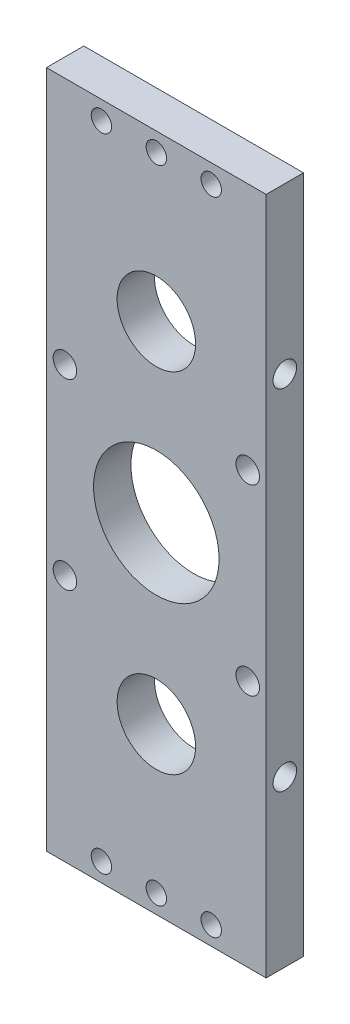
ISO-10303-21;
HEADER;
FILE_DESCRIPTION(('STEP AP214'),'2;1');
FILE_NAME('part.step','',(''),(''),'','','');
FILE_SCHEMA(('AUTOMOTIVE_DESIGN { 1 0 10303 214 1 1 1 1 }'));
ENDSEC;
DATA;
#1=APPLICATION_CONTEXT('core data for automotive mechanical design processes');
#2=APPLICATION_PROTOCOL_DEFINITION('international standard','automotive_design',2000,#1);
#3=PRODUCT_CONTEXT('',#1,'mechanical');
#4=PRODUCT('Part','Part','',(#3));
#5=PRODUCT_RELATED_PRODUCT_CATEGORY('part','',(#4));
#6=PRODUCT_DEFINITION_FORMATION('','',#4);
#7=PRODUCT_DEFINITION_CONTEXT('part definition',#1,'design');
#8=PRODUCT_DEFINITION('design','',#6,#7);
#9=PRODUCT_DEFINITION_SHAPE('','',#8);
#10=(LENGTH_UNIT() NAMED_UNIT(*) SI_UNIT(.MILLI.,.METRE.));
#11=(NAMED_UNIT(*) PLANE_ANGLE_UNIT() SI_UNIT($,.RADIAN.));
#12=(NAMED_UNIT(*) SI_UNIT($,.STERADIAN.) SOLID_ANGLE_UNIT());
#13=UNCERTAINTY_MEASURE_WITH_UNIT(LENGTH_MEASURE(1.E-05),#10,'distance_accuracy_value','');
#14=(GEOMETRIC_REPRESENTATION_CONTEXT(3) GLOBAL_UNCERTAINTY_ASSIGNED_CONTEXT((#13)) GLOBAL_UNIT_ASSIGNED_CONTEXT((#10,
#11,#12)) REPRESENTATION_CONTEXT('',''));
#15=CARTESIAN_POINT('',(0.,0.,0.));
#16=DIRECTION('',(0.,0.,1.));
#17=DIRECTION('',(1.,0.,0.));
#18=AXIS2_PLACEMENT_3D('',#15,#16,#17);
#19=CARTESIAN_POINT('',(-28.001,-44.47,4.76249999999998));
#20=DIRECTION('',(1.,0.,0.));
#21=DIRECTION('',(0.,1.,0.));
#22=AXIS2_PLACEMENT_3D('',#19,#20,#21);
#23=CYLINDRICAL_SURFACE('',#22,2.);
#24=CARTESIAN_POINT('',(9.79795897113272,-42.47,4.76249999999998));
#25=CARTESIAN_POINT('',(9.79796118053294,-42.4700041082494,4.65137124901767));
#26=CARTESIAN_POINT('',(9.79987016537405,-42.4792936565637,4.54019075333331));
#27=CARTESIAN_POINT('',(9.80728862609751,-42.5161754328343,4.32097498971372));
#28=CARTESIAN_POINT('',(9.81280098289576,-42.543782305859,4.21294231072802));
#29=CARTESIAN_POINT('',(9.8267774744371,-42.6164084347605,4.00322539329156));
#30=CARTESIAN_POINT('',(9.83523867242152,-42.6614103716947,3.9015349569348));
#31=CARTESIAN_POINT('',(9.85415598961318,-42.767501784659,3.70715031060607));
#32=CARTESIAN_POINT('',(9.86461199746923,-42.8285903627977,3.61445559892418));
#33=CARTESIAN_POINT('',(9.88650599388506,-42.9660418486931,3.43937799229226));
#34=CARTESIAN_POINT('',(9.89795475674494,-43.0425886881733,3.35714082423204));
#35=CARTESIAN_POINT('',(9.92044944605198,-43.2083864219573,3.20658493284202));
#36=CARTESIAN_POINT('',(9.93149534421664,-43.297638206044,3.1382671851656));
#37=CARTESIAN_POINT('',(9.95205592835125,-43.4872772881515,3.01692396474306));
#38=CARTESIAN_POINT('',(9.96155642883102,-43.5877548646556,2.9640369723667));
#39=CARTESIAN_POINT('',(9.97783473767264,-43.7963916992254,2.87595012590371));
#40=CARTESIAN_POINT('',(9.98461280088239,-43.9045502371589,2.840748616198));
#41=CARTESIAN_POINT('',(9.99460641376838,-44.123966453443,2.78948561276073));
#42=CARTESIAN_POINT('',(9.99786772576255,-44.2351645215703,2.77317804485797));
#43=CARTESIAN_POINT('',(10.0006184236721,-44.4587628631249,2.75939809632335));
#44=CARTESIAN_POINT('',(10.0001081730552,-44.5711630196637,2.76192390070834));
#45=CARTESIAN_POINT('',(9.99540869737032,-44.7922840014872,2.78555236043109));
#46=CARTESIAN_POINT('',(9.99127196731677,-44.9010344285969,2.80638995433568));
#47=CARTESIAN_POINT('',(9.97984354318818,-45.1134632531606,2.86563006491777));
#48=CARTESIAN_POINT('',(9.97255172288079,-45.2171414474942,2.90403328438373));
#49=CARTESIAN_POINT('',(9.95554592039917,-45.4172389264018,2.99756008029452));
#50=CARTESIAN_POINT('',(9.94581696350447,-45.5136083482678,3.05278750220976));
#51=CARTESIAN_POINT('',(9.92500938947571,-45.6958100917195,3.17831815447318));
#52=CARTESIAN_POINT('',(9.91393061710445,-45.78164119905,3.24862311954102));
#53=CARTESIAN_POINT('',(9.89141928728919,-45.9419028621069,3.40376724421693));
#54=CARTESIAN_POINT('',(9.87998392915032,-46.0161086331472,3.48883837345917));
#55=CARTESIAN_POINT('',(9.85823143197521,-46.1492369863536,3.67033288490149));
#56=CARTESIAN_POINT('',(9.84791431409096,-46.2081592794555,3.76675648176638));
#57=CARTESIAN_POINT('',(9.82956094945848,-46.3091256296037,3.9685416636436));
#58=CARTESIAN_POINT('',(9.82152963127098,-46.3511332955554,4.07392193527931));
#59=CARTESIAN_POINT('',(9.80872952642546,-46.4167806832551,4.29044264744797));
#60=CARTESIAN_POINT('',(9.80396031456856,-46.4404227989132,4.40158233523815));
#61=CARTESIAN_POINT('',(9.79830958535655,-46.4683320120721,4.62442971599808));
#62=CARTESIAN_POINT('',(9.79736294114308,-46.4729237177958,4.73609514862067));
#63=CARTESIAN_POINT('',(9.79928971377708,-46.4634752566215,4.95859644639935));
#64=CARTESIAN_POINT('',(9.80216291400776,-46.4494361462449,5.06943235823771));
#65=CARTESIAN_POINT('',(9.81134464989829,-46.4034044161483,5.28603728058446));
#66=CARTESIAN_POINT('',(9.81761998028994,-46.3715852416786,5.39184468607151));
#67=CARTESIAN_POINT('',(9.8328697870333,-46.291082070617,5.59662655805747));
#68=CARTESIAN_POINT('',(9.84184448572539,-46.2423966847463,5.69560046087143));
#69=CARTESIAN_POINT('',(9.86162811924079,-46.1288082844312,5.88532621990031));
#70=CARTESIAN_POINT('',(9.87245943729807,-46.0637021559655,5.97595409260164));
#71=CARTESIAN_POINT('',(9.89467447653273,-45.9193911444254,6.14511662400182));
#72=CARTESIAN_POINT('',(9.90605825447637,-45.8401848102891,6.2236500364985));
#73=CARTESIAN_POINT('',(9.92830691738432,-45.6684645469958,6.36762511837114));
#74=CARTESIAN_POINT('',(9.93916115417368,-45.5757649978592,6.43284730929998));
#75=CARTESIAN_POINT('',(9.9589425525724,-45.3805357932695,6.54679176299915));
#76=CARTESIAN_POINT('',(9.96786979510423,-45.278006550867,6.59551471868955));
#77=CARTESIAN_POINT('',(9.98274588122133,-45.066605361648,6.67475774349326));
#78=CARTESIAN_POINT('',(9.98871158285206,-44.9577733469561,6.70538103645249));
#79=CARTESIAN_POINT('',(9.99706471875324,-44.7363789093598,6.74788249532767));
#80=CARTESIAN_POINT('',(9.99945258399699,-44.6238169374224,6.75976291895134));
#81=CARTESIAN_POINT('',(10.0003708090823,-44.4002542121927,6.76435396192577));
#82=CARTESIAN_POINT('',(9.9989675709866,-44.289260375717,6.75739456091244));
#83=CARTESIAN_POINT('',(9.99260087120679,-44.0700579373687,6.72523209890433));
#84=CARTESIAN_POINT('',(9.98763745428863,-43.9618493004925,6.70002926730372));
#85=CARTESIAN_POINT('',(9.97470996729842,-43.7514945005098,6.63224201581681));
#86=CARTESIAN_POINT('',(9.96675274495231,-43.6493351135196,6.58969724373803));
#87=CARTESIAN_POINT('',(9.94869444247361,-43.4535575596278,6.48847551733776));
#88=CARTESIAN_POINT('',(9.93859319293977,-43.3599400684643,6.42979728819099));
#89=CARTESIAN_POINT('',(9.91715198313481,-43.1822722197881,6.29686122587742));
#90=CARTESIAN_POINT('',(9.90579466835802,-43.0984005677703,6.22236732723244));
#91=CARTESIAN_POINT('',(9.88322445815731,-42.944234764483,6.06039951980244));
#92=CARTESIAN_POINT('',(9.87201159757439,-42.8739438335821,5.97292254104014));
#93=CARTESIAN_POINT('',(9.85086685467864,-42.7482155611,5.78634136661913));
#94=CARTESIAN_POINT('',(9.84095007142453,-42.6929463707638,5.68712207775748));
#95=CARTESIAN_POINT('',(9.82370474252827,-42.5999519014675,5.48063445347978));
#96=CARTESIAN_POINT('',(9.81637385049969,-42.5622107080516,5.3733735226256));
#97=CARTESIAN_POINT('',(9.80659362275691,-42.5126617202847,5.18197508911424));
#98=CARTESIAN_POINT('',(9.80337569829213,-42.4966922029526,5.09892916097207));
#99=CARTESIAN_POINT('',(9.7990575691817,-42.4753599640805,4.93143209089771));
#100=CARTESIAN_POINT('',(9.79795729152837,-42.4699968768747,4.84698099751105));
#101=CARTESIAN_POINT('',(9.79795897113272,-42.47,4.76249999999998));
#102=B_SPLINE_CURVE_WITH_KNOTS('',3,(#24,#25,#26,#27,#28,#29,#30,#31,#32,#33,#34,#35,#36,#37,
#38,#39,#40,#41,#42,#43,#44,#45,#46,#47,#48,#49,#50,#51,#52,#53,#54,#55,#56,#57,#58,#59,#60,#61,
#62,#63,#64,#65,#66,#67,#68,#69,#70,#71,#72,#73,#74,#75,#76,#77,#78,#79,#80,#81,#82,#83,#84,#85,
#86,#87,#88,#89,#90,#91,#92,#93,#94,#95,#96,#97,#98,#99,#100,#101),.UNSPECIFIED.,.T.,.F.,(4,2,2,
2,2,2,2,2,2,2,2,2,2,2,2,2,2,2,2,2,2,2,2,2,2,2,2,2,2,2,2,2,2,2,2,2,2,2,4),(0.,0.333076927738854,
0.666420478568594,0.999432995881174,1.33242692971973,1.66964505096874,2.00688680070845,
2.34706800874901,2.6872173649312,3.02288497766161,3.35852024232497,3.68937579267076,
4.02024458147501,4.35319848444607,4.68619071540133,5.02498693524967,5.36378956245441,
5.70331726345554,6.0428007003205,6.37647515609188,6.71013069056844,7.04058683566638,
7.37107020708797,7.70586119549042,8.04068665740418,8.38065203466902,8.7206031326021,
9.058596271573,9.39654869383257,9.72862034829374,10.0606878273352,10.392000341509,
10.7233390426937,11.0600230405119,11.3967867777956,11.7371779715922,12.077259501804,
12.3304760727632,12.5836839137096),.UNSPECIFIED.);
#103=CARTESIAN_POINT('',(9.79795897113272,-42.47,4.76249999999998));
#104=VERTEX_POINT('',#103);
#105=EDGE_CURVE('E108',#104,#104,#102,.T.);
#106=ORIENTED_EDGE('',*,*,#105,.T.);
#107=EDGE_LOOP('',(#106));
#108=FACE_BOUND('',#107,.T.);
#109=CARTESIAN_POINT('',(21.,-44.47,4.76249999999998));
#110=DIRECTION('',(1.,0.,0.));
#111=DIRECTION('',(0.,1.,0.));
#112=AXIS2_PLACEMENT_3D('',#109,#110,#111);
#113=CIRCLE('',#112,2.);
#114=CARTESIAN_POINT('',(21.,-42.47,4.76249999999998));
#115=VERTEX_POINT('',#114);
#116=EDGE_CURVE('E35',#115,#115,#113,.F.);
#117=ORIENTED_EDGE('',*,*,#116,.F.);
#118=EDGE_LOOP('',(#117));
#119=FACE_BOUND('',#118,.T.);
#120=ADVANCED_FACE('F31',(#108,#119),#23,.F.);
#121=CARTESIAN_POINT('',(-28.001,44.47,4.76249999999999));
#122=DIRECTION('',(1.,0.,0.));
#123=DIRECTION('',(0.,1.,0.));
#124=AXIS2_PLACEMENT_3D('',#121,#122,#123);
#125=CYLINDRICAL_SURFACE('',#124,2.);
#126=CARTESIAN_POINT('',(9.79795897113272,46.47,4.76249999999999));
#127=CARTESIAN_POINT('',(9.79796118053293,46.4699958917506,4.65137124901768));
#128=CARTESIAN_POINT('',(9.79987016537404,46.4607063434363,4.54019075333332));
#129=CARTESIAN_POINT('',(9.8072886260975,46.4238245671657,4.32097498971373));
#130=CARTESIAN_POINT('',(9.81280098289575,46.396217694141,4.21294231072803));
#131=CARTESIAN_POINT('',(9.82677747443709,46.3235915652395,4.00322539329157));
#132=CARTESIAN_POINT('',(9.83523867242151,46.2785896283053,3.90153495693482));
#133=CARTESIAN_POINT('',(9.85415598961317,46.1724982153411,3.70715031060609));
#134=CARTESIAN_POINT('',(9.86461199746923,46.1114096372023,3.61445559892419));
#135=CARTESIAN_POINT('',(9.88650599388506,45.9739581513069,3.43937799229228));
#136=CARTESIAN_POINT('',(9.89795475674493,45.8974113118267,3.35714082423206));
#137=CARTESIAN_POINT('',(9.92044944605197,45.7316135780427,3.20658493284204));
#138=CARTESIAN_POINT('',(9.93149534421664,45.642361793956,3.13826718516561));
#139=CARTESIAN_POINT('',(9.95205592835125,45.4527227118485,3.01692396474308));
#140=CARTESIAN_POINT('',(9.96155642883102,45.3522451353445,2.96403697236672));
#141=CARTESIAN_POINT('',(9.97783473767264,45.1436083007746,2.87595012590372));
#142=CARTESIAN_POINT('',(9.98461280088239,45.0354497628411,2.84074861619801));
#143=CARTESIAN_POINT('',(9.99460641376837,44.816033546557,2.78948561276074));
#144=CARTESIAN_POINT('',(9.99786772576255,44.7048354784297,2.77317804485798));
#145=CARTESIAN_POINT('',(10.0006184236721,44.4812371368751,2.75939809632336));
#146=CARTESIAN_POINT('',(10.0001081730552,44.3688369803364,2.76192390070835));
#147=CARTESIAN_POINT('',(9.99540869737032,44.1477159985129,2.7855523604311));
#148=CARTESIAN_POINT('',(9.99127196731677,44.0389655714031,2.80638995433569));
#149=CARTESIAN_POINT('',(9.97984354318818,43.8265367468394,2.86563006491778));
#150=CARTESIAN_POINT('',(9.97255172288079,43.7228585525058,2.90403328438374));
#151=CARTESIAN_POINT('',(9.95554592039918,43.5227610735983,2.99756008029453));
#152=CARTESIAN_POINT('',(9.94581696350448,43.4263916517322,3.05278750220977));
#153=CARTESIAN_POINT('',(9.92500938947571,43.2441899082805,3.1783181544732));
#154=CARTESIAN_POINT('',(9.91393061710445,43.15835880095,3.24862311954103));
#155=CARTESIAN_POINT('',(9.8914192872892,42.9980971378931,3.40376724421694));
#156=CARTESIAN_POINT('',(9.87998392915033,42.9238913668528,3.48883837345918));
#157=CARTESIAN_POINT('',(9.85823143197522,42.7907630136464,3.6703328849015));
#158=CARTESIAN_POINT('',(9.84791431409097,42.7318407205445,3.76675648176639));
#159=CARTESIAN_POINT('',(9.82956094945848,42.6308743703963,3.9685416636436));
#160=CARTESIAN_POINT('',(9.82152963127099,42.5888667044446,4.07392193527932));
#161=CARTESIAN_POINT('',(9.80872952642546,42.5232193167449,4.29044264744798));
#162=CARTESIAN_POINT('',(9.80396031456856,42.4995772010868,4.40158233523816));
#163=CARTESIAN_POINT('',(9.79830958535656,42.4716679879279,4.62442971599808));
#164=CARTESIAN_POINT('',(9.79736294114309,42.4670762822042,4.73609514862068));
#165=CARTESIAN_POINT('',(9.79928971377709,42.4765247433786,4.95859644639936));
#166=CARTESIAN_POINT('',(9.80216291400777,42.4905638537552,5.06943235823772));
#167=CARTESIAN_POINT('',(9.8113446498983,42.5365955838517,5.28603728058447));
#168=CARTESIAN_POINT('',(9.81761998028994,42.5684147583214,5.39184468607152));
#169=CARTESIAN_POINT('',(9.8328697870333,42.648917929383,5.59662655805748));
#170=CARTESIAN_POINT('',(9.8418444857254,42.6976033152537,5.69560046087144));
#171=CARTESIAN_POINT('',(9.86162811924079,42.8111917155688,5.88532621990032));
#172=CARTESIAN_POINT('',(9.87245943729807,42.8762978440345,5.97595409260165));
#173=CARTESIAN_POINT('',(9.89467447653274,43.0206088555746,6.14511662400183));
#174=CARTESIAN_POINT('',(9.90605825447637,43.099815189711,6.22365003649851));
#175=CARTESIAN_POINT('',(9.92830691738432,43.2715354530043,6.36762511837115));
#176=CARTESIAN_POINT('',(9.93916115417368,43.3642350021408,6.43284730929999));
#177=CARTESIAN_POINT('',(9.9589425525724,43.5594642067305,6.54679176299916));
#178=CARTESIAN_POINT('',(9.96786979510423,43.661993449133,6.59551471868956));
#179=CARTESIAN_POINT('',(9.98274588122134,43.873394638352,6.67475774349327));
#180=CARTESIAN_POINT('',(9.98871158285206,43.9822266530439,6.7053810364525));
#181=CARTESIAN_POINT('',(9.99706471875324,44.2036210906402,6.74788249532769));
#182=CARTESIAN_POINT('',(9.99945258399699,44.3161830625776,6.75976291895135));
#183=CARTESIAN_POINT('',(10.0003708090823,44.5397457878073,6.76435396192578));
#184=CARTESIAN_POINT('',(9.9989675709866,44.650739624283,6.75739456091245));
#185=CARTESIAN_POINT('',(9.99260087120679,44.8699420626313,6.72523209890434));
#186=CARTESIAN_POINT('',(9.98763745428863,44.9781506995075,6.70002926730374));
#187=CARTESIAN_POINT('',(9.97470996729842,45.1885054994902,6.63224201581682));
#188=CARTESIAN_POINT('',(9.96675274495231,45.2906648864804,6.58969724373805));
#189=CARTESIAN_POINT('',(9.94869444247361,45.4864424403722,6.48847551733777));
#190=CARTESIAN_POINT('',(9.93859319293977,45.5800599315357,6.429797288191));
#191=CARTESIAN_POINT('',(9.91715198313481,45.7577277802119,6.29686122587743));
#192=CARTESIAN_POINT('',(9.90579466835802,45.8415994322297,6.22236732723245));
#193=CARTESIAN_POINT('',(9.8832244581573,45.995765235517,6.06039951980245));
#194=CARTESIAN_POINT('',(9.87201159757439,46.0660561664179,5.97292254104015));
#195=CARTESIAN_POINT('',(9.85086685467864,46.1917844389,5.78634136661914));
#196=CARTESIAN_POINT('',(9.84095007142452,46.2470536292362,5.68712207775749));
#197=CARTESIAN_POINT('',(9.82370474252827,46.3400480985325,5.48063445347979));
#198=CARTESIAN_POINT('',(9.81637385049968,46.3777892919484,5.37337352262562));
#199=CARTESIAN_POINT('',(9.80659362275691,46.4273382797153,5.18197508911425));
#200=CARTESIAN_POINT('',(9.80337569829213,46.4433077970474,5.09892916097208));
#201=CARTESIAN_POINT('',(9.79905756918169,46.4646400359195,4.93143209089773));
#202=CARTESIAN_POINT('',(9.79795729152837,46.4700031231253,4.84698099751106));
#203=CARTESIAN_POINT('',(9.79795897113272,46.47,4.76249999999999));
#204=B_SPLINE_CURVE_WITH_KNOTS('',3,(#126,#127,#128,#129,#130,#131,#132,#133,#134,#135,#136,
#137,#138,#139,#140,#141,#142,#143,#144,#145,#146,#147,#148,#149,#150,#151,#152,#153,#154,#155,
#156,#157,#158,#159,#160,#161,#162,#163,#164,#165,#166,#167,#168,#169,#170,#171,#172,#173,#174,
#175,#176,#177,#178,#179,#180,#181,#182,#183,#184,#185,#186,#187,#188,#189,#190,#191,#192,#193,
#194,#195,#196,#197,#198,#199,#200,#201,#202,#203),.UNSPECIFIED.,.T.,.F.,(4,2,2,2,2,2,2,2,2,2,2,
2,2,2,2,2,2,2,2,2,2,2,2,2,2,2,2,2,2,2,2,2,2,2,2,2,2,2,4),(0.,0.333076927738854,
0.666420478568593,0.999432995881166,1.33242692971973,1.66964505096872,2.00688680070844,
2.347068008749,2.6872173649312,3.02288497766161,3.35852024232496,3.68937579267075,
4.02024458147501,4.35319848444607,4.68619071540133,5.02498693524967,5.36378956245441,
5.70331726345554,6.0428007003205,6.37647515609188,6.71013069056844,7.04058683566638,
7.37107020708797,7.70586119549042,8.04068665740418,8.38065203466902,8.7206031326021,
9.05859627157302,9.39654869383257,9.72862034829373,10.0606878273351,10.392000341509,
10.7233390426937,11.0600230405119,11.3967867777956,11.7371779715922,12.077259501804,
12.3304760727632,12.5836839137096),.UNSPECIFIED.);
#205=CARTESIAN_POINT('',(9.79795897113272,46.47,4.76249999999999));
#206=VERTEX_POINT('',#205);
#207=EDGE_CURVE('E113',#206,#206,#204,.T.);
#208=ORIENTED_EDGE('',*,*,#207,.T.);
#209=EDGE_LOOP('',(#208));
#210=FACE_BOUND('',#209,.T.);
#211=CARTESIAN_POINT('',(21.,44.47,4.76249999999999));
#212=DIRECTION('',(1.,0.,0.));
#213=DIRECTION('',(0.,1.,0.));
#214=AXIS2_PLACEMENT_3D('',#211,#212,#213);
#215=CIRCLE('',#214,2.);
#216=CARTESIAN_POINT('',(21.,46.47,4.76249999999999));
#217=VERTEX_POINT('',#216);
#218=EDGE_CURVE('E106',#217,#217,#215,.F.);
#219=ORIENTED_EDGE('',*,*,#218,.F.);
#220=EDGE_LOOP('',(#219));
#221=FACE_BOUND('',#220,.T.);
#222=ADVANCED_FACE('F158',(#210,#221),#125,.F.);
#223=CARTESIAN_POINT('',(-28.,86.5,9.525));
#224=DIRECTION('',(1.,0.,0.));
#225=DIRECTION('',(0.,1.,0.));
#226=AXIS2_PLACEMENT_3D('',#223,#224,#225);
#227=PLANE('',#226);
#228=DIRECTION('',(0.,-1.,0.));
#229=VECTOR('',#228,1.);
#230=CARTESIAN_POINT('',(-28.,86.5,0.));
#231=LINE('',#230,#229);
#232=CARTESIAN_POINT('',(-28.,86.5,0.));
#233=VERTEX_POINT('',#232);
#234=CARTESIAN_POINT('',(-28.,-86.5,0.));
#235=VERTEX_POINT('',#234);
#236=EDGE_CURVE('E98',#233,#235,#231,.T.);
#237=ORIENTED_EDGE('',*,*,#236,.T.);
#238=DIRECTION('',(0.,0.,-1.));
#239=VECTOR('',#238,1.);
#240=CARTESIAN_POINT('',(-28.,-86.5,9.525));
#241=LINE('',#240,#239);
#242=CARTESIAN_POINT('',(-28.,-86.5,9.525));
#243=VERTEX_POINT('',#242);
#244=EDGE_CURVE('E11',#243,#235,#241,.T.);
#245=ORIENTED_EDGE('',*,*,#244,.F.);
#246=DIRECTION('',(0.,-1.,0.));
#247=VECTOR('',#246,1.);
#248=CARTESIAN_POINT('',(-28.,86.5,9.525));
#249=LINE('',#248,#247);
#250=CARTESIAN_POINT('',(-28.,86.5,9.525));
#251=VERTEX_POINT('',#250);
#252=EDGE_CURVE('E85',#251,#243,#249,.T.);
#253=ORIENTED_EDGE('',*,*,#252,.F.);
#254=DIRECTION('',(0.,0.,-1.));
#255=VECTOR('',#254,1.);
#256=CARTESIAN_POINT('',(-28.,86.5,9.525));
#257=LINE('',#256,#255);
#258=EDGE_CURVE('E94',#251,#233,#257,.T.);
#259=ORIENTED_EDGE('',*,*,#258,.T.);
#260=EDGE_LOOP('',(#237,#245,#253,#259));
#261=FACE_BOUND('',#260,.T.);
#262=ADVANCED_FACE('F33',(#261),#227,.F.);
#263=CARTESIAN_POINT('',(-28.,-86.5,9.525));
#264=DIRECTION('',(0.,1.,0.));
#265=DIRECTION('',(0.,0.,1.));
#266=AXIS2_PLACEMENT_3D('',#263,#264,#265);
#267=PLANE('',#266);
#268=DIRECTION('',(1.,0.,0.));
#269=VECTOR('',#268,1.);
#270=CARTESIAN_POINT('',(-28.,-86.5,0.));
#271=LINE('',#270,#269);
#272=CARTESIAN_POINT('',(28.,-86.5,0.));
#273=VERTEX_POINT('',#272);
#274=EDGE_CURVE('E89',#235,#273,#271,.T.);
#275=ORIENTED_EDGE('',*,*,#274,.T.);
#276=DIRECTION('',(0.,0.,-1.));
#277=VECTOR('',#276,1.);
#278=CARTESIAN_POINT('',(28.,-86.5,9.525));
#279=LINE('',#278,#277);
#280=CARTESIAN_POINT('',(28.,-86.5,9.525));
#281=VERTEX_POINT('',#280);
#282=EDGE_CURVE('E41',#281,#273,#279,.T.);
#283=ORIENTED_EDGE('',*,*,#282,.F.);
#284=DIRECTION('',(1.,0.,0.));
#285=VECTOR('',#284,1.);
#286=CARTESIAN_POINT('',(-28.,-86.5,9.525));
#287=LINE('',#286,#285);
#288=EDGE_CURVE('E80',#243,#281,#287,.T.);
#289=ORIENTED_EDGE('',*,*,#288,.F.);
#290=ORIENTED_EDGE('',*,*,#244,.T.);
#291=EDGE_LOOP('',(#275,#283,#289,#290));
#292=FACE_BOUND('',#291,.T.);
#293=ADVANCED_FACE('F88',(#292),#267,.F.);
#294=CARTESIAN_POINT('',(28.,86.5,9.525));
#295=DIRECTION('',(-1.,0.,0.));
#296=DIRECTION('',(0.,-1.,0.));
#297=AXIS2_PLACEMENT_3D('',#294,#295,#296);
#298=PLANE('',#297);
#299=CARTESIAN_POINT('',(28.,-44.47,4.76249999999998));
#300=DIRECTION('',(1.,0.,0.));
#301=DIRECTION('',(0.,1.,0.));
#302=AXIS2_PLACEMENT_3D('',#299,#300,#301);
#303=CIRCLE('',#302,3.);
#304=CARTESIAN_POINT('',(28.,-41.47,4.76249999999998));
#305=VERTEX_POINT('',#304);
#306=EDGE_CURVE('E123',#305,#305,#303,.T.);
#307=ORIENTED_EDGE('',*,*,#306,.F.);
#308=EDGE_LOOP('',(#307));
#309=FACE_BOUND('',#308,.T.);
#310=CARTESIAN_POINT('',(28.,44.47,4.76249999999999));
#311=DIRECTION('',(1.,0.,0.));
#312=DIRECTION('',(0.,1.,0.));
#313=AXIS2_PLACEMENT_3D('',#310,#311,#312);
#314=CIRCLE('',#313,3.);
#315=CARTESIAN_POINT('',(28.,47.47,4.76249999999999));
#316=VERTEX_POINT('',#315);
#317=EDGE_CURVE('E116',#316,#316,#314,.T.);
#318=ORIENTED_EDGE('',*,*,#317,.F.);
#319=EDGE_LOOP('',(#318));
#320=FACE_BOUND('',#319,.T.);
#321=DIRECTION('',(0.,1.,0.));
#322=VECTOR('',#321,1.);
#323=CARTESIAN_POINT('',(28.,86.5,0.));
#324=LINE('',#323,#322);
#325=CARTESIAN_POINT('',(28.,86.5,0.));
#326=VERTEX_POINT('',#325);
#327=EDGE_CURVE('E67',#273,#326,#324,.T.);
#328=ORIENTED_EDGE('',*,*,#327,.T.);
#329=DIRECTION('',(0.,0.,-1.));
#330=VECTOR('',#329,1.);
#331=CARTESIAN_POINT('',(28.,86.5,9.525));
#332=LINE('',#331,#330);
#333=CARTESIAN_POINT('',(28.,86.5,9.525));
#334=VERTEX_POINT('',#333);
#335=EDGE_CURVE('E90',#334,#326,#332,.T.);
#336=ORIENTED_EDGE('',*,*,#335,.F.);
#337=DIRECTION('',(0.,1.,0.));
#338=VECTOR('',#337,1.);
#339=CARTESIAN_POINT('',(28.,86.5,9.525));
#340=LINE('',#339,#338);
#341=EDGE_CURVE('E83',#281,#334,#340,.T.);
#342=ORIENTED_EDGE('',*,*,#341,.F.);
#343=ORIENTED_EDGE('',*,*,#282,.T.);
#344=EDGE_LOOP('',(#328,#336,#342,#343));
#345=FACE_BOUND('',#344,.T.);
#346=ADVANCED_FACE('F92',(#309,#320,#345),#298,.F.);
#347=CARTESIAN_POINT('',(-28.,86.5,9.525));
#348=DIRECTION('',(0.,-1.,0.));
#349=DIRECTION('',(0.,0.,-1.));
#350=AXIS2_PLACEMENT_3D('',#347,#348,#349);
#351=PLANE('',#350);
#352=DIRECTION('',(-1.,0.,0.));
#353=VECTOR('',#352,1.);
#354=CARTESIAN_POINT('',(-28.,86.5,0.));
#355=LINE('',#354,#353);
#356=EDGE_CURVE('E73',#326,#233,#355,.T.);
#357=ORIENTED_EDGE('',*,*,#356,.T.);
#358=ORIENTED_EDGE('',*,*,#258,.F.);
#359=DIRECTION('',(-1.,0.,0.));
#360=VECTOR('',#359,1.);
#361=CARTESIAN_POINT('',(-28.,86.5,9.525));
#362=LINE('',#361,#360);
#363=EDGE_CURVE('E50',#334,#251,#362,.T.);
#364=ORIENTED_EDGE('',*,*,#363,.F.);
#365=ORIENTED_EDGE('',*,*,#335,.T.);
#366=EDGE_LOOP('',(#357,#358,#364,#365));
#367=FACE_BOUND('',#366,.T.);
#368=ADVANCED_FACE('F176',(#367),#351,.F.);
#369=CARTESIAN_POINT('',(-28.,-86.5,9.525));
#370=DIRECTION('',(0.,0.,1.));
#371=DIRECTION('',(1.,0.,0.));
#372=AXIS2_PLACEMENT_3D('',#369,#370,#371);
#373=PLANE('',#372);
#374=CARTESIAN_POINT('',(-14.,-81.74,9.525));
#375=DIRECTION('',(0.,0.,1.));
#376=DIRECTION('',(1.,0.,0.));
#377=AXIS2_PLACEMENT_3D('',#374,#375,#376);
#378=CIRCLE('',#377,2.6);
#379=CARTESIAN_POINT('',(-11.4,-81.74,9.525));
#380=VERTEX_POINT('',#379);
#381=EDGE_CURVE('E253',#380,#380,#378,.T.);
#382=ORIENTED_EDGE('',*,*,#381,.F.);
#383=EDGE_LOOP('',(#382));
#384=FACE_BOUND('',#383,.T.);
#385=CARTESIAN_POINT('',(0.,-81.74,9.525));
#386=DIRECTION('',(0.,0.,1.));
#387=DIRECTION('',(-1.,0.,0.));
#388=AXIS2_PLACEMENT_3D('',#385,#386,#387);
#389=CIRCLE('',#388,2.6);
#390=CARTESIAN_POINT('',(-2.59999999999997,-81.74,9.525));
#391=VERTEX_POINT('',#390);
#392=EDGE_CURVE('E254',#391,#391,#389,.T.);
#393=ORIENTED_EDGE('',*,*,#392,.F.);
#394=EDGE_LOOP('',(#393));
#395=FACE_BOUND('',#394,.T.);
#396=CARTESIAN_POINT('',(14.,-81.74,9.525));
#397=DIRECTION('',(0.,0.,1.));
#398=DIRECTION('',(-1.,0.,0.));
#399=AXIS2_PLACEMENT_3D('',#396,#397,#398);
#400=CIRCLE('',#399,2.6);
#401=CARTESIAN_POINT('',(11.4,-81.74,9.525));
#402=VERTEX_POINT('',#401);
#403=EDGE_CURVE('E263',#402,#402,#400,.T.);
#404=ORIENTED_EDGE('',*,*,#403,.F.);
#405=EDGE_LOOP('',(#404));
#406=FACE_BOUND('',#405,.T.);
#407=CARTESIAN_POINT('',(-14.,81.74,9.525));
#408=DIRECTION('',(0.,0.,1.));
#409=DIRECTION('',(-1.,0.,0.));
#410=AXIS2_PLACEMENT_3D('',#407,#408,#409);
#411=CIRCLE('',#410,2.6);
#412=CARTESIAN_POINT('',(-16.6,81.74,9.525));
#413=VERTEX_POINT('',#412);
#414=EDGE_CURVE('E269',#413,#413,#411,.T.);
#415=ORIENTED_EDGE('',*,*,#414,.F.);
#416=EDGE_LOOP('',(#415));
#417=FACE_BOUND('',#416,.T.);
#418=CARTESIAN_POINT('',(14.,81.74,9.525));
#419=DIRECTION('',(0.,0.,1.));
#420=DIRECTION('',(1.,0.,0.));
#421=AXIS2_PLACEMENT_3D('',#418,#419,#420);
#422=CIRCLE('',#421,2.6);
#423=CARTESIAN_POINT('',(16.6,81.74,9.525));
#424=VERTEX_POINT('',#423);
#425=EDGE_CURVE('E275',#424,#424,#422,.T.);
#426=ORIENTED_EDGE('',*,*,#425,.F.);
#427=EDGE_LOOP('',(#426));
#428=FACE_BOUND('',#427,.T.);
#429=CARTESIAN_POINT('',(0.,81.74,9.525));
#430=DIRECTION('',(0.,0.,1.));
#431=DIRECTION('',(1.,0.,0.));
#432=AXIS2_PLACEMENT_3D('',#429,#430,#431);
#433=CIRCLE('',#432,2.6);
#434=CARTESIAN_POINT('',(2.60000000000001,81.74,9.525));
#435=VERTEX_POINT('',#434);
#436=EDGE_CURVE('E281',#435,#435,#433,.T.);
#437=ORIENTED_EDGE('',*,*,#436,.F.);
#438=EDGE_LOOP('',(#437));
#439=FACE_BOUND('',#438,.T.);
#440=CARTESIAN_POINT('',(-23.3,23.3,9.525));
#441=DIRECTION('',(0.,0.,1.));
#442=DIRECTION('',(-1.,0.,0.));
#443=AXIS2_PLACEMENT_3D('',#440,#441,#442);
#444=CIRCLE('',#443,3.);
#445=CARTESIAN_POINT('',(-26.3,23.3,9.525));
#446=VERTEX_POINT('',#445);
#447=EDGE_CURVE('E287',#446,#446,#444,.T.);
#448=ORIENTED_EDGE('',*,*,#447,.F.);
#449=EDGE_LOOP('',(#448));
#450=FACE_BOUND('',#449,.T.);
#451=CARTESIAN_POINT('',(-23.3,-23.3,9.525));
#452=DIRECTION('',(0.,0.,1.));
#453=DIRECTION('',(1.,0.,0.));
#454=AXIS2_PLACEMENT_3D('',#451,#452,#453);
#455=CIRCLE('',#454,3.);
#456=CARTESIAN_POINT('',(-20.3,-23.3,9.525));
#457=VERTEX_POINT('',#456);
#458=EDGE_CURVE('E293',#457,#457,#455,.T.);
#459=ORIENTED_EDGE('',*,*,#458,.F.);
#460=EDGE_LOOP('',(#459));
#461=FACE_BOUND('',#460,.T.);
#462=CARTESIAN_POINT('',(23.3,-23.3,9.525));
#463=DIRECTION('',(0.,0.,1.));
#464=DIRECTION('',(-1.,0.,0.));
#465=AXIS2_PLACEMENT_3D('',#462,#463,#464);
#466=CIRCLE('',#465,3.);
#467=CARTESIAN_POINT('',(20.3,-23.3,9.525));
#468=VERTEX_POINT('',#467);
#469=EDGE_CURVE('E299',#468,#468,#466,.T.);
#470=ORIENTED_EDGE('',*,*,#469,.F.);
#471=EDGE_LOOP('',(#470));
#472=FACE_BOUND('',#471,.T.);
#473=CARTESIAN_POINT('',(23.3,23.3,9.525));
#474=DIRECTION('',(0.,0.,1.));
#475=DIRECTION('',(1.,0.,0.));
#476=AXIS2_PLACEMENT_3D('',#473,#474,#475);
#477=CIRCLE('',#476,3.);
#478=CARTESIAN_POINT('',(26.3,23.3,9.525));
#479=VERTEX_POINT('',#478);
#480=EDGE_CURVE('E305',#479,#479,#477,.T.);
#481=ORIENTED_EDGE('',*,*,#480,.F.);
#482=EDGE_LOOP('',(#481));
#483=FACE_BOUND('',#482,.T.);
#484=CARTESIAN_POINT('',(0.,-44.4699999999999,9.525));
#485=DIRECTION('',(0.,0.,1.));
#486=DIRECTION('',(-1.,0.,0.));
#487=AXIS2_PLACEMENT_3D('',#484,#485,#486);
#488=CIRCLE('',#487,10.);
#489=CARTESIAN_POINT('',(-10.,-44.4699999999999,9.525));
#490=VERTEX_POINT('',#489);
#491=EDGE_CURVE('E311',#490,#490,#488,.T.);
#492=ORIENTED_EDGE('',*,*,#491,.F.);
#493=EDGE_LOOP('',(#492));
#494=FACE_BOUND('',#493,.T.);
#495=CARTESIAN_POINT('',(0.,44.47,9.525));
#496=DIRECTION('',(0.,0.,1.));
#497=DIRECTION('',(1.,0.,0.));
#498=AXIS2_PLACEMENT_3D('',#495,#496,#497);
#499=CIRCLE('',#498,10.);
#500=CARTESIAN_POINT('',(10.,44.47,9.525));
#501=VERTEX_POINT('',#500);
#502=EDGE_CURVE('E317',#501,#501,#499,.T.);
#503=ORIENTED_EDGE('',*,*,#502,.F.);
#504=EDGE_LOOP('',(#503));
#505=FACE_BOUND('',#504,.T.);
#506=CARTESIAN_POINT('',(0.,0.,9.525));
#507=DIRECTION('',(0.,0.,1.));
#508=DIRECTION('',(1.,0.,0.));
#509=AXIS2_PLACEMENT_3D('',#506,#507,#508);
#510=CIRCLE('',#509,16.);
#511=CARTESIAN_POINT('',(16.,0.,9.525));
#512=VERTEX_POINT('',#511);
#513=EDGE_CURVE('E323',#512,#512,#510,.T.);
#514=ORIENTED_EDGE('',*,*,#513,.F.);
#515=EDGE_LOOP('',(#514));
#516=FACE_BOUND('',#515,.T.);
#517=ORIENTED_EDGE('',*,*,#252,.T.);
#518=ORIENTED_EDGE('',*,*,#288,.T.);
#519=ORIENTED_EDGE('',*,*,#341,.T.);
#520=ORIENTED_EDGE('',*,*,#363,.T.);
#521=EDGE_LOOP('',(#517,#518,#519,#520));
#522=FACE_BOUND('',#521,.T.);
#523=ADVANCED_FACE('F81',(#384,#395,#406,#417,#428,#439,#450,#461,#472,#483,#494,#505,#516,
#522),#373,.T.);
#524=CARTESIAN_POINT('',(-28.,-86.5,0.));
#525=DIRECTION('',(0.,0.,1.));
#526=DIRECTION('',(1.,0.,0.));
#527=AXIS2_PLACEMENT_3D('',#524,#525,#526);
#528=PLANE('',#527);
#529=CARTESIAN_POINT('',(-14.,-81.74,0.));
#530=DIRECTION('',(0.,0.,1.));
#531=DIRECTION('',(1.,0.,0.));
#532=AXIS2_PLACEMENT_3D('',#529,#530,#531);
#533=CIRCLE('',#532,2.6);
#534=CARTESIAN_POINT('',(-11.4,-81.74,0.));
#535=VERTEX_POINT('',#534);
#536=EDGE_CURVE('E250',#535,#535,#533,.F.);
#537=ORIENTED_EDGE('',*,*,#536,.F.);
#538=EDGE_LOOP('',(#537));
#539=FACE_BOUND('',#538,.T.);
#540=CARTESIAN_POINT('',(0.,-81.74,0.));
#541=DIRECTION('',(0.,0.,1.));
#542=DIRECTION('',(1.,0.,0.));
#543=AXIS2_PLACEMENT_3D('',#540,#541,#542);
#544=CIRCLE('',#543,2.6);
#545=CARTESIAN_POINT('',(2.60000000000003,-81.74,0.));
#546=VERTEX_POINT('',#545);
#547=EDGE_CURVE('E260',#546,#546,#544,.F.);
#548=ORIENTED_EDGE('',*,*,#547,.F.);
#549=EDGE_LOOP('',(#548));
#550=FACE_BOUND('',#549,.T.);
#551=CARTESIAN_POINT('',(14.,-81.74,0.));
#552=DIRECTION('',(0.,0.,1.));
#553=DIRECTION('',(1.,0.,0.));
#554=AXIS2_PLACEMENT_3D('',#551,#552,#553);
#555=CIRCLE('',#554,2.6);
#556=CARTESIAN_POINT('',(16.6,-81.74,0.));
#557=VERTEX_POINT('',#556);
#558=EDGE_CURVE('E266',#557,#557,#555,.F.);
#559=ORIENTED_EDGE('',*,*,#558,.F.);
#560=EDGE_LOOP('',(#559));
#561=FACE_BOUND('',#560,.T.);
#562=CARTESIAN_POINT('',(-14.,81.74,0.));
#563=DIRECTION('',(0.,0.,1.));
#564=DIRECTION('',(1.,0.,0.));
#565=AXIS2_PLACEMENT_3D('',#562,#563,#564);
#566=CIRCLE('',#565,2.6);
#567=CARTESIAN_POINT('',(-11.4,81.74,0.));
#568=VERTEX_POINT('',#567);
#569=EDGE_CURVE('E272',#568,#568,#566,.F.);
#570=ORIENTED_EDGE('',*,*,#569,.F.);
#571=EDGE_LOOP('',(#570));
#572=FACE_BOUND('',#571,.T.);
#573=CARTESIAN_POINT('',(14.,81.74,0.));
#574=DIRECTION('',(0.,0.,1.));
#575=DIRECTION('',(1.,0.,0.));
#576=AXIS2_PLACEMENT_3D('',#573,#574,#575);
#577=CIRCLE('',#576,2.6);
#578=CARTESIAN_POINT('',(16.6,81.74,0.));
#579=VERTEX_POINT('',#578);
#580=EDGE_CURVE('E278',#579,#579,#577,.F.);
#581=ORIENTED_EDGE('',*,*,#580,.F.);
#582=EDGE_LOOP('',(#581));
#583=FACE_BOUND('',#582,.T.);
#584=CARTESIAN_POINT('',(0.,81.74,0.));
#585=DIRECTION('',(0.,0.,1.));
#586=DIRECTION('',(1.,0.,0.));
#587=AXIS2_PLACEMENT_3D('',#584,#585,#586);
#588=CIRCLE('',#587,2.6);
#589=CARTESIAN_POINT('',(2.60000000000001,81.74,0.));
#590=VERTEX_POINT('',#589);
#591=EDGE_CURVE('E284',#590,#590,#588,.F.);
#592=ORIENTED_EDGE('',*,*,#591,.F.);
#593=EDGE_LOOP('',(#592));
#594=FACE_BOUND('',#593,.T.);
#595=CARTESIAN_POINT('',(-23.3,23.3,0.));
#596=DIRECTION('',(0.,0.,1.));
#597=DIRECTION('',(1.,0.,0.));
#598=AXIS2_PLACEMENT_3D('',#595,#596,#597);
#599=CIRCLE('',#598,3.);
#600=CARTESIAN_POINT('',(-20.3,23.3,0.));
#601=VERTEX_POINT('',#600);
#602=EDGE_CURVE('E290',#601,#601,#599,.F.);
#603=ORIENTED_EDGE('',*,*,#602,.F.);
#604=EDGE_LOOP('',(#603));
#605=FACE_BOUND('',#604,.T.);
#606=CARTESIAN_POINT('',(-23.3,-23.3,0.));
#607=DIRECTION('',(0.,0.,1.));
#608=DIRECTION('',(1.,0.,0.));
#609=AXIS2_PLACEMENT_3D('',#606,#607,#608);
#610=CIRCLE('',#609,3.);
#611=CARTESIAN_POINT('',(-20.3,-23.3,0.));
#612=VERTEX_POINT('',#611);
#613=EDGE_CURVE('E296',#612,#612,#610,.F.);
#614=ORIENTED_EDGE('',*,*,#613,.F.);
#615=EDGE_LOOP('',(#614));
#616=FACE_BOUND('',#615,.T.);
#617=CARTESIAN_POINT('',(23.3,-23.3,0.));
#618=DIRECTION('',(0.,0.,1.));
#619=DIRECTION('',(1.,0.,0.));
#620=AXIS2_PLACEMENT_3D('',#617,#618,#619);
#621=CIRCLE('',#620,3.);
#622=CARTESIAN_POINT('',(26.3,-23.3,0.));
#623=VERTEX_POINT('',#622);
#624=EDGE_CURVE('E302',#623,#623,#621,.F.);
#625=ORIENTED_EDGE('',*,*,#624,.F.);
#626=EDGE_LOOP('',(#625));
#627=FACE_BOUND('',#626,.T.);
#628=CARTESIAN_POINT('',(23.3,23.3,0.));
#629=DIRECTION('',(0.,0.,1.));
#630=DIRECTION('',(1.,0.,0.));
#631=AXIS2_PLACEMENT_3D('',#628,#629,#630);
#632=CIRCLE('',#631,3.);
#633=CARTESIAN_POINT('',(26.3,23.3,0.));
#634=VERTEX_POINT('',#633);
#635=EDGE_CURVE('E308',#634,#634,#632,.F.);
#636=ORIENTED_EDGE('',*,*,#635,.F.);
#637=EDGE_LOOP('',(#636));
#638=FACE_BOUND('',#637,.T.);
#639=CARTESIAN_POINT('',(0.,-44.4699999999999,0.));
#640=DIRECTION('',(0.,0.,1.));
#641=DIRECTION('',(1.,0.,0.));
#642=AXIS2_PLACEMENT_3D('',#639,#640,#641);
#643=CIRCLE('',#642,10.);
#644=CARTESIAN_POINT('',(10.,-44.4699999999999,0.));
#645=VERTEX_POINT('',#644);
#646=EDGE_CURVE('E314',#645,#645,#643,.F.);
#647=ORIENTED_EDGE('',*,*,#646,.F.);
#648=EDGE_LOOP('',(#647));
#649=FACE_BOUND('',#648,.T.);
#650=CARTESIAN_POINT('',(0.,44.47,0.));
#651=DIRECTION('',(0.,0.,1.));
#652=DIRECTION('',(1.,0.,0.));
#653=AXIS2_PLACEMENT_3D('',#650,#651,#652);
#654=CIRCLE('',#653,10.);
#655=CARTESIAN_POINT('',(10.,44.47,0.));
#656=VERTEX_POINT('',#655);
#657=EDGE_CURVE('E320',#656,#656,#654,.F.);
#658=ORIENTED_EDGE('',*,*,#657,.F.);
#659=EDGE_LOOP('',(#658));
#660=FACE_BOUND('',#659,.T.);
#661=CARTESIAN_POINT('',(0.,0.,0.));
#662=DIRECTION('',(0.,0.,1.));
#663=DIRECTION('',(1.,0.,0.));
#664=AXIS2_PLACEMENT_3D('',#661,#662,#663);
#665=CIRCLE('',#664,16.);
#666=CARTESIAN_POINT('',(16.,0.,0.));
#667=VERTEX_POINT('',#666);
#668=EDGE_CURVE('E101',#667,#667,#665,.F.);
#669=ORIENTED_EDGE('',*,*,#668,.F.);
#670=EDGE_LOOP('',(#669));
#671=FACE_BOUND('',#670,.T.);
#672=ORIENTED_EDGE('',*,*,#236,.F.);
#673=ORIENTED_EDGE('',*,*,#356,.F.);
#674=ORIENTED_EDGE('',*,*,#327,.F.);
#675=ORIENTED_EDGE('',*,*,#274,.F.);
#676=EDGE_LOOP('',(#672,#673,#674,#675));
#677=FACE_BOUND('',#676,.T.);
#678=ADVANCED_FACE('F186',(#539,#550,#561,#572,#583,#594,#605,#616,#627,#638,#649,#660,#671,
#677),#528,.F.);
#679=CARTESIAN_POINT('',(0.,0.,-45.254833995939));
#680=DIRECTION('',(0.,0.,1.));
#681=DIRECTION('',(1.,0.,0.));
#682=AXIS2_PLACEMENT_3D('',#679,#680,#681);
#683=CYLINDRICAL_SURFACE('',#682,16.);
#684=ORIENTED_EDGE('',*,*,#668,.T.);
#685=EDGE_LOOP('',(#684));
#686=FACE_BOUND('',#685,.T.);
#687=ORIENTED_EDGE('',*,*,#513,.T.);
#688=EDGE_LOOP('',(#687));
#689=FACE_BOUND('',#688,.T.);
#690=ADVANCED_FACE('F189',(#686,#689),#683,.F.);
#691=CARTESIAN_POINT('',(0.,44.47,-45.254833995939));
#692=DIRECTION('',(0.,0.,1.));
#693=DIRECTION('',(1.,0.,0.));
#694=AXIS2_PLACEMENT_3D('',#691,#692,#693);
#695=CYLINDRICAL_SURFACE('',#694,10.);
#696=ORIENTED_EDGE('',*,*,#207,.F.);
#697=EDGE_LOOP('',(#696));
#698=FACE_BOUND('',#697,.T.);
#699=ORIENTED_EDGE('',*,*,#657,.T.);
#700=EDGE_LOOP('',(#699));
#701=FACE_BOUND('',#700,.T.);
#702=ORIENTED_EDGE('',*,*,#502,.T.);
#703=EDGE_LOOP('',(#702));
#704=FACE_BOUND('',#703,.T.);
#705=ADVANCED_FACE('F196',(#698,#701,#704),#695,.F.);
#706=CARTESIAN_POINT('',(0.,-44.4699999999999,-45.254833995939));
#707=DIRECTION('',(0.,0.,1.));
#708=DIRECTION('',(1.,0.,0.));
#709=AXIS2_PLACEMENT_3D('',#706,#707,#708);
#710=CYLINDRICAL_SURFACE('',#709,10.);
#711=ORIENTED_EDGE('',*,*,#105,.F.);
#712=EDGE_LOOP('',(#711));
#713=FACE_BOUND('',#712,.T.);
#714=ORIENTED_EDGE('',*,*,#646,.T.);
#715=EDGE_LOOP('',(#714));
#716=FACE_BOUND('',#715,.T.);
#717=ORIENTED_EDGE('',*,*,#491,.T.);
#718=EDGE_LOOP('',(#717));
#719=FACE_BOUND('',#718,.T.);
#720=ADVANCED_FACE('F200',(#713,#716,#719),#710,.F.);
#721=CARTESIAN_POINT('',(23.3,23.3,-45.254833995939));
#722=DIRECTION('',(0.,0.,1.));
#723=DIRECTION('',(1.,0.,0.));
#724=AXIS2_PLACEMENT_3D('',#721,#722,#723);
#725=CYLINDRICAL_SURFACE('',#724,3.);
#726=ORIENTED_EDGE('',*,*,#635,.T.);
#727=EDGE_LOOP('',(#726));
#728=FACE_BOUND('',#727,.T.);
#729=ORIENTED_EDGE('',*,*,#480,.T.);
#730=EDGE_LOOP('',(#729));
#731=FACE_BOUND('',#730,.T.);
#732=ADVANCED_FACE('F204',(#728,#731),#725,.F.);
#733=CARTESIAN_POINT('',(23.3,-23.3,-45.254833995939));
#734=DIRECTION('',(0.,0.,1.));
#735=DIRECTION('',(1.,0.,0.));
#736=AXIS2_PLACEMENT_3D('',#733,#734,#735);
#737=CYLINDRICAL_SURFACE('',#736,3.);
#738=ORIENTED_EDGE('',*,*,#624,.T.);
#739=EDGE_LOOP('',(#738));
#740=FACE_BOUND('',#739,.T.);
#741=ORIENTED_EDGE('',*,*,#469,.T.);
#742=EDGE_LOOP('',(#741));
#743=FACE_BOUND('',#742,.T.);
#744=ADVANCED_FACE('F208',(#740,#743),#737,.F.);
#745=CARTESIAN_POINT('',(-23.3,-23.3,-45.254833995939));
#746=DIRECTION('',(0.,0.,1.));
#747=DIRECTION('',(1.,0.,0.));
#748=AXIS2_PLACEMENT_3D('',#745,#746,#747);
#749=CYLINDRICAL_SURFACE('',#748,3.);
#750=ORIENTED_EDGE('',*,*,#613,.T.);
#751=EDGE_LOOP('',(#750));
#752=FACE_BOUND('',#751,.T.);
#753=ORIENTED_EDGE('',*,*,#458,.T.);
#754=EDGE_LOOP('',(#753));
#755=FACE_BOUND('',#754,.T.);
#756=ADVANCED_FACE('F212',(#752,#755),#749,.F.);
#757=CARTESIAN_POINT('',(-23.3,23.3,-45.254833995939));
#758=DIRECTION('',(0.,0.,1.));
#759=DIRECTION('',(1.,0.,0.));
#760=AXIS2_PLACEMENT_3D('',#757,#758,#759);
#761=CYLINDRICAL_SURFACE('',#760,3.);
#762=ORIENTED_EDGE('',*,*,#602,.T.);
#763=EDGE_LOOP('',(#762));
#764=FACE_BOUND('',#763,.T.);
#765=ORIENTED_EDGE('',*,*,#447,.T.);
#766=EDGE_LOOP('',(#765));
#767=FACE_BOUND('',#766,.T.);
#768=ADVANCED_FACE('F216',(#764,#767),#761,.F.);
#769=CARTESIAN_POINT('',(0.,81.74,-45.254833995939));
#770=DIRECTION('',(0.,0.,1.));
#771=DIRECTION('',(1.,0.,0.));
#772=AXIS2_PLACEMENT_3D('',#769,#770,#771);
#773=CYLINDRICAL_SURFACE('',#772,2.6);
#774=ORIENTED_EDGE('',*,*,#591,.T.);
#775=EDGE_LOOP('',(#774));
#776=FACE_BOUND('',#775,.T.);
#777=ORIENTED_EDGE('',*,*,#436,.T.);
#778=EDGE_LOOP('',(#777));
#779=FACE_BOUND('',#778,.T.);
#780=ADVANCED_FACE('F220',(#776,#779),#773,.F.);
#781=CARTESIAN_POINT('',(14.,81.74,-45.254833995939));
#782=DIRECTION('',(0.,0.,1.));
#783=DIRECTION('',(1.,0.,0.));
#784=AXIS2_PLACEMENT_3D('',#781,#782,#783);
#785=CYLINDRICAL_SURFACE('',#784,2.6);
#786=ORIENTED_EDGE('',*,*,#580,.T.);
#787=EDGE_LOOP('',(#786));
#788=FACE_BOUND('',#787,.T.);
#789=ORIENTED_EDGE('',*,*,#425,.T.);
#790=EDGE_LOOP('',(#789));
#791=FACE_BOUND('',#790,.T.);
#792=ADVANCED_FACE('F224',(#788,#791),#785,.F.);
#793=CARTESIAN_POINT('',(-14.,81.74,-45.254833995939));
#794=DIRECTION('',(0.,0.,1.));
#795=DIRECTION('',(1.,0.,0.));
#796=AXIS2_PLACEMENT_3D('',#793,#794,#795);
#797=CYLINDRICAL_SURFACE('',#796,2.6);
#798=ORIENTED_EDGE('',*,*,#569,.T.);
#799=EDGE_LOOP('',(#798));
#800=FACE_BOUND('',#799,.T.);
#801=ORIENTED_EDGE('',*,*,#414,.T.);
#802=EDGE_LOOP('',(#801));
#803=FACE_BOUND('',#802,.T.);
#804=ADVANCED_FACE('F228',(#800,#803),#797,.F.);
#805=CARTESIAN_POINT('',(14.,-81.74,-45.254833995939));
#806=DIRECTION('',(0.,0.,1.));
#807=DIRECTION('',(1.,0.,0.));
#808=AXIS2_PLACEMENT_3D('',#805,#806,#807);
#809=CYLINDRICAL_SURFACE('',#808,2.6);
#810=ORIENTED_EDGE('',*,*,#558,.T.);
#811=EDGE_LOOP('',(#810));
#812=FACE_BOUND('',#811,.T.);
#813=ORIENTED_EDGE('',*,*,#403,.T.);
#814=EDGE_LOOP('',(#813));
#815=FACE_BOUND('',#814,.T.);
#816=ADVANCED_FACE('F232',(#812,#815),#809,.F.);
#817=CARTESIAN_POINT('',(0.,-81.74,-45.254833995939));
#818=DIRECTION('',(0.,0.,1.));
#819=DIRECTION('',(1.,0.,0.));
#820=AXIS2_PLACEMENT_3D('',#817,#818,#819);
#821=CYLINDRICAL_SURFACE('',#820,2.6);
#822=ORIENTED_EDGE('',*,*,#547,.T.);
#823=EDGE_LOOP('',(#822));
#824=FACE_BOUND('',#823,.T.);
#825=ORIENTED_EDGE('',*,*,#392,.T.);
#826=EDGE_LOOP('',(#825));
#827=FACE_BOUND('',#826,.T.);
#828=ADVANCED_FACE('F236',(#824,#827),#821,.F.);
#829=CARTESIAN_POINT('',(-14.,-81.74,-45.254833995939));
#830=DIRECTION('',(0.,0.,1.));
#831=DIRECTION('',(1.,0.,0.));
#832=AXIS2_PLACEMENT_3D('',#829,#830,#831);
#833=CYLINDRICAL_SURFACE('',#832,2.6);
#834=ORIENTED_EDGE('',*,*,#536,.T.);
#835=EDGE_LOOP('',(#834));
#836=FACE_BOUND('',#835,.T.);
#837=ORIENTED_EDGE('',*,*,#381,.T.);
#838=EDGE_LOOP('',(#837));
#839=FACE_BOUND('',#838,.T.);
#840=ADVANCED_FACE('F146',(#836,#839),#833,.F.);
#841=CARTESIAN_POINT('',(21.,44.47,4.76249999999999));
#842=DIRECTION('',(1.,0.,0.));
#843=DIRECTION('',(0.,1.,0.));
#844=AXIS2_PLACEMENT_3D('',#841,#842,#843);
#845=PLANE('',#844);
#846=CARTESIAN_POINT('',(21.,44.47,4.76249999999999));
#847=DIRECTION('',(1.,0.,0.));
#848=DIRECTION('',(0.,1.,0.));
#849=AXIS2_PLACEMENT_3D('',#846,#847,#848);
#850=CIRCLE('',#849,3.);
#851=CARTESIAN_POINT('',(21.,47.47,4.76249999999999));
#852=VERTEX_POINT('',#851);
#853=EDGE_CURVE('E109',#852,#852,#850,.T.);
#854=ORIENTED_EDGE('',*,*,#853,.T.);
#855=EDGE_LOOP('',(#854));
#856=FACE_BOUND('',#855,.T.);
#857=ORIENTED_EDGE('',*,*,#218,.T.);
#858=EDGE_LOOP('',(#857));
#859=FACE_BOUND('',#858,.T.);
#860=ADVANCED_FACE('F142',(#856,#859),#845,.T.);
#861=CARTESIAN_POINT('',(21.,44.47,4.76249999999999));
#862=DIRECTION('',(1.,0.,0.));
#863=DIRECTION('',(0.,1.,0.));
#864=AXIS2_PLACEMENT_3D('',#861,#862,#863);
#865=CYLINDRICAL_SURFACE('',#864,3.);
#866=ORIENTED_EDGE('',*,*,#853,.F.);
#867=EDGE_LOOP('',(#866));
#868=FACE_BOUND('',#867,.T.);
#869=ORIENTED_EDGE('',*,*,#317,.T.);
#870=EDGE_LOOP('',(#869));
#871=FACE_BOUND('',#870,.T.);
#872=ADVANCED_FACE('F138',(#868,#871),#865,.F.);
#873=CARTESIAN_POINT('',(21.,-44.47,4.76249999999998));
#874=DIRECTION('',(1.,0.,0.));
#875=DIRECTION('',(0.,1.,0.));
#876=AXIS2_PLACEMENT_3D('',#873,#874,#875);
#877=PLANE('',#876);
#878=CARTESIAN_POINT('',(21.,-44.47,4.76249999999998));
#879=DIRECTION('',(1.,0.,0.));
#880=DIRECTION('',(0.,1.,0.));
#881=AXIS2_PLACEMENT_3D('',#878,#879,#880);
#882=CIRCLE('',#881,3.);
#883=CARTESIAN_POINT('',(21.,-41.47,4.76249999999998));
#884=VERTEX_POINT('',#883);
#885=EDGE_CURVE('E168',#884,#884,#882,.T.);
#886=ORIENTED_EDGE('',*,*,#885,.T.);
#887=EDGE_LOOP('',(#886));
#888=FACE_BOUND('',#887,.T.);
#889=ORIENTED_EDGE('',*,*,#116,.T.);
#890=EDGE_LOOP('',(#889));
#891=FACE_BOUND('',#890,.T.);
#892=ADVANCED_FACE('F141',(#888,#891),#877,.T.);
#893=CARTESIAN_POINT('',(21.,-44.47,4.76249999999998));
#894=DIRECTION('',(1.,0.,0.));
#895=DIRECTION('',(0.,1.,0.));
#896=AXIS2_PLACEMENT_3D('',#893,#894,#895);
#897=CYLINDRICAL_SURFACE('',#896,3.);
#898=ORIENTED_EDGE('',*,*,#885,.F.);
#899=EDGE_LOOP('',(#898));
#900=FACE_BOUND('',#899,.T.);
#901=ORIENTED_EDGE('',*,*,#306,.T.);
#902=EDGE_LOOP('',(#901));
#903=FACE_BOUND('',#902,.T.);
#904=ADVANCED_FACE('F147',(#900,#903),#897,.F.);
#905=CLOSED_SHELL('',(#120,#222,#262,#293,#346,#368,#523,#678,#690,#705,#720,#732,#744,#756,
#768,#780,#792,#804,#816,#828,#840,#860,#872,#892,#904));
#906=MANIFOLD_SOLID_BREP('B2',#905);
#907=ADVANCED_BREP_SHAPE_REPRESENTATION('',(#18,#906),#14);
#908=SHAPE_DEFINITION_REPRESENTATION(#9,#907);
ENDSEC;
END-ISO-10303-21;
